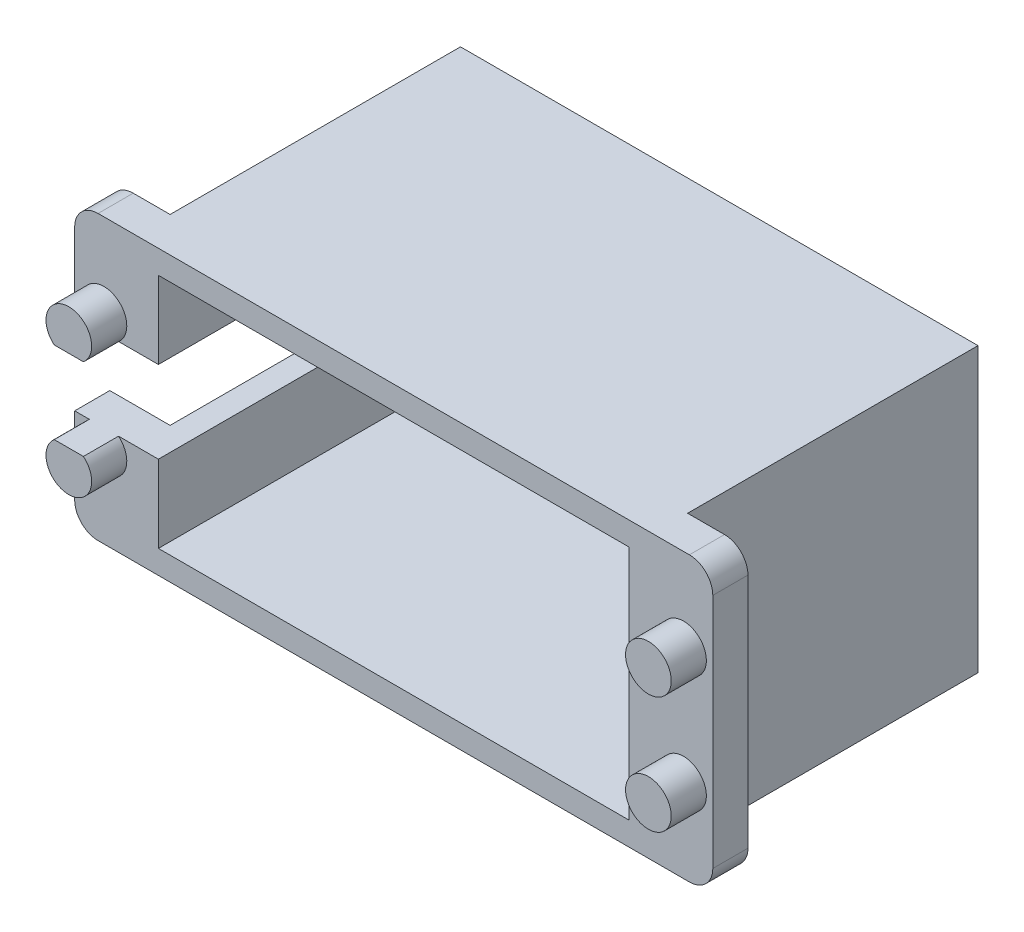
ISO-10303-21;
HEADER;
FILE_DESCRIPTION(('STEP AP214'),'2;1');
FILE_NAME('part.step','',(''),(''),'','','');
FILE_SCHEMA(('AUTOMOTIVE_DESIGN { 1 0 10303 214 1 1 1 1 }'));
ENDSEC;
DATA;
#1=APPLICATION_CONTEXT('core data for automotive mechanical design processes');
#2=APPLICATION_PROTOCOL_DEFINITION('international standard','automotive_design',2000,#1);
#3=PRODUCT_CONTEXT('',#1,'mechanical');
#4=PRODUCT('Part','Part','',(#3));
#5=PRODUCT_RELATED_PRODUCT_CATEGORY('part','',(#4));
#6=PRODUCT_DEFINITION_FORMATION('','',#4);
#7=PRODUCT_DEFINITION_CONTEXT('part definition',#1,'design');
#8=PRODUCT_DEFINITION('design','',#6,#7);
#9=PRODUCT_DEFINITION_SHAPE('','',#8);
#10=(LENGTH_UNIT() NAMED_UNIT(*) SI_UNIT(.MILLI.,.METRE.));
#11=(NAMED_UNIT(*) PLANE_ANGLE_UNIT() SI_UNIT($,.RADIAN.));
#12=(NAMED_UNIT(*) SI_UNIT($,.STERADIAN.) SOLID_ANGLE_UNIT());
#13=UNCERTAINTY_MEASURE_WITH_UNIT(LENGTH_MEASURE(1.E-05),#10,'distance_accuracy_value','');
#14=(GEOMETRIC_REPRESENTATION_CONTEXT(3) GLOBAL_UNCERTAINTY_ASSIGNED_CONTEXT((#13)) GLOBAL_UNIT_ASSIGNED_CONTEXT((#10,
#11,#12)) REPRESENTATION_CONTEXT('',''));
#15=CARTESIAN_POINT('',(0.,0.,0.));
#16=DIRECTION('',(0.,0.,1.));
#17=DIRECTION('',(1.,0.,0.));
#18=AXIS2_PLACEMENT_3D('',#15,#16,#17);
#19=CARTESIAN_POINT('',(0.,0.,27.8));
#20=DIRECTION('',(0.,0.,1.));
#21=DIRECTION('',(1.,0.,0.));
#22=AXIS2_PLACEMENT_3D('',#19,#20,#21);
#23=PLANE('',#22);
#24=CARTESIAN_POINT('',(44.85,15.1,27.8));
#25=DIRECTION('',(0.,0.,1.));
#26=DIRECTION('',(-1.,0.,0.));
#27=AXIS2_PLACEMENT_3D('',#24,#25,#26);
#28=CIRCLE('',#27,1.95);
#29=CARTESIAN_POINT('',(42.9,15.1,27.8));
#30=VERTEX_POINT('',#29);
#31=EDGE_CURVE('E508',#30,#30,#28,.T.);
#32=ORIENTED_EDGE('',*,*,#31,.F.);
#33=EDGE_LOOP('',(#32));
#34=FACE_BOUND('',#33,.T.);
#35=CARTESIAN_POINT('',(44.85,5.1,27.8));
#36=DIRECTION('',(0.,0.,1.));
#37=DIRECTION('',(-1.,0.,0.));
#38=AXIS2_PLACEMENT_3D('',#35,#36,#37);
#39=CIRCLE('',#38,1.95);
#40=CARTESIAN_POINT('',(42.9,5.1,27.8));
#41=VERTEX_POINT('',#40);
#42=EDGE_CURVE('E371',#41,#41,#39,.T.);
#43=ORIENTED_EDGE('',*,*,#42,.F.);
#44=EDGE_LOOP('',(#43));
#45=FACE_BOUND('',#44,.T.);
#46=DIRECTION('',(1.,0.,0.));
#47=VECTOR('',#46,1.);
#48=CARTESIAN_POINT('',(0.,6.6,27.8));
#49=LINE('',#48,#47);
#50=CARTESIAN_POINT('',(-3.40400642056229,6.6,27.8));
#51=VERTEX_POINT('',#50);
#52=CARTESIAN_POINT('',(0.,6.6,27.8));
#53=VERTEX_POINT('',#52);
#54=EDGE_CURVE('E245',#51,#53,#49,.T.);
#55=ORIENTED_EDGE('',*,*,#54,.F.);
#56=CARTESIAN_POINT('',(-4.65,5.1,27.8));
#57=DIRECTION('',(0.,0.,1.));
#58=DIRECTION('',(1.,0.,0.));
#59=AXIS2_PLACEMENT_3D('',#56,#57,#58);
#60=CIRCLE('',#59,1.95);
#61=CARTESIAN_POINT('',(-5.89599357943771,6.6,27.8));
#62=VERTEX_POINT('',#61);
#63=EDGE_CURVE('E65',#62,#51,#60,.T.);
#64=ORIENTED_EDGE('',*,*,#63,.F.);
#65=CARTESIAN_POINT('',(-7.15,6.6,27.8));
#66=VERTEX_POINT('',#65);
#67=EDGE_CURVE('E242',#66,#62,#49,.T.);
#68=ORIENTED_EDGE('',*,*,#67,.F.);
#69=DIRECTION('',(0.,-1.,0.));
#70=VECTOR('',#69,1.);
#71=CARTESIAN_POINT('',(-7.15,0.,27.8));
#72=LINE('',#71,#70);
#73=CARTESIAN_POINT('',(-7.15,0.,27.8));
#74=VERTEX_POINT('',#73);
#75=EDGE_CURVE('E400',#66,#74,#72,.T.);
#76=ORIENTED_EDGE('',*,*,#75,.T.);
#77=CARTESIAN_POINT('',(-5.15,0.,27.8));
#78=DIRECTION('',(0.,0.,1.));
#79=DIRECTION('',(1.,0.,0.));
#80=AXIS2_PLACEMENT_3D('',#77,#78,#79);
#81=CIRCLE('',#80,2.);
#82=CARTESIAN_POINT('',(-5.14999999999998,-2.,27.8));
#83=VERTEX_POINT('',#82);
#84=EDGE_CURVE('E390',#83,#74,#81,.F.);
#85=ORIENTED_EDGE('',*,*,#84,.F.);
#86=DIRECTION('',(1.,0.,0.));
#87=VECTOR('',#86,1.);
#88=CARTESIAN_POINT('',(0.,-2.,27.8));
#89=LINE('',#88,#87);
#90=CARTESIAN_POINT('',(45.35,-2.,27.8));
#91=VERTEX_POINT('',#90);
#92=EDGE_CURVE('E253',#83,#91,#89,.T.);
#93=ORIENTED_EDGE('',*,*,#92,.T.);
#94=CARTESIAN_POINT('',(45.35,0.,27.8));
#95=DIRECTION('',(0.,0.,1.));
#96=DIRECTION('',(1.,0.,0.));
#97=AXIS2_PLACEMENT_3D('',#94,#95,#96);
#98=CIRCLE('',#97,2.);
#99=CARTESIAN_POINT('',(47.35,0.,27.8));
#100=VERTEX_POINT('',#99);
#101=EDGE_CURVE('E381',#91,#100,#98,.T.);
#102=ORIENTED_EDGE('',*,*,#101,.T.);
#103=DIRECTION('',(0.,-1.,0.));
#104=VECTOR('',#103,1.);
#105=CARTESIAN_POINT('',(47.35,0.,27.8));
#106=LINE('',#105,#104);
#107=CARTESIAN_POINT('',(47.35,20.2,27.8));
#108=VERTEX_POINT('',#107);
#109=EDGE_CURVE('E368',#108,#100,#106,.T.);
#110=ORIENTED_EDGE('',*,*,#109,.F.);
#111=CARTESIAN_POINT('',(45.35,20.2,27.8));
#112=DIRECTION('',(0.,0.,1.));
#113=DIRECTION('',(1.,0.,0.));
#114=AXIS2_PLACEMENT_3D('',#111,#112,#113);
#115=CIRCLE('',#114,2.);
#116=CARTESIAN_POINT('',(45.35,22.2,27.8));
#117=VERTEX_POINT('',#116);
#118=EDGE_CURVE('E364',#117,#108,#115,.F.);
#119=ORIENTED_EDGE('',*,*,#118,.F.);
#120=DIRECTION('',(1.,0.,0.));
#121=VECTOR('',#120,1.);
#122=CARTESIAN_POINT('',(0.,22.2,27.8));
#123=LINE('',#122,#121);
#124=CARTESIAN_POINT('',(-5.14999999999999,22.2,27.8));
#125=VERTEX_POINT('',#124);
#126=EDGE_CURVE('E256',#125,#117,#123,.T.);
#127=ORIENTED_EDGE('',*,*,#126,.F.);
#128=CARTESIAN_POINT('',(-5.15,20.2,27.8));
#129=DIRECTION('',(0.,0.,1.));
#130=DIRECTION('',(1.,0.,0.));
#131=AXIS2_PLACEMENT_3D('',#128,#129,#130);
#132=CIRCLE('',#131,2.);
#133=CARTESIAN_POINT('',(-7.15,20.2,27.8));
#134=VERTEX_POINT('',#133);
#135=EDGE_CURVE('E417',#125,#134,#132,.T.);
#136=ORIENTED_EDGE('',*,*,#135,.T.);
#137=DIRECTION('',(0.,-1.,0.));
#138=VECTOR('',#137,1.);
#139=CARTESIAN_POINT('',(-7.15,0.,27.8));
#140=LINE('',#139,#138);
#141=CARTESIAN_POINT('',(-7.15,13.6,27.8));
#142=VERTEX_POINT('',#141);
#143=EDGE_CURVE('E427',#134,#142,#140,.T.);
#144=ORIENTED_EDGE('',*,*,#143,.T.);
#145=DIRECTION('',(1.,0.,0.));
#146=VECTOR('',#145,1.);
#147=CARTESIAN_POINT('',(0.,13.6,27.8));
#148=LINE('',#147,#146);
#149=CARTESIAN_POINT('',(-5.89599357943771,13.6,27.8));
#150=VERTEX_POINT('',#149);
#151=EDGE_CURVE('E73',#142,#150,#148,.T.);
#152=ORIENTED_EDGE('',*,*,#151,.T.);
#153=CARTESIAN_POINT('',(-4.65,15.1,27.8));
#154=DIRECTION('',(0.,0.,1.));
#155=DIRECTION('',(1.,0.,0.));
#156=AXIS2_PLACEMENT_3D('',#153,#154,#155);
#157=CIRCLE('',#156,1.95);
#158=CARTESIAN_POINT('',(-3.40400642056229,13.6,27.8));
#159=VERTEX_POINT('',#158);
#160=EDGE_CURVE('E489',#159,#150,#157,.T.);
#161=ORIENTED_EDGE('',*,*,#160,.F.);
#162=CARTESIAN_POINT('',(0.,13.6,27.8));
#163=VERTEX_POINT('',#162);
#164=EDGE_CURVE('E266',#159,#163,#148,.T.);
#165=ORIENTED_EDGE('',*,*,#164,.T.);
#166=DIRECTION('',(0.,1.,0.));
#167=VECTOR('',#166,1.);
#168=CARTESIAN_POINT('',(0.,0.,27.8));
#169=LINE('',#168,#167);
#170=CARTESIAN_POINT('',(0.,20.2,27.8));
#171=VERTEX_POINT('',#170);
#172=EDGE_CURVE('E268',#163,#171,#169,.T.);
#173=ORIENTED_EDGE('',*,*,#172,.T.);
#174=DIRECTION('',(1.,0.,0.));
#175=VECTOR('',#174,1.);
#176=CARTESIAN_POINT('',(0.,20.2,27.8));
#177=LINE('',#176,#175);
#178=CARTESIAN_POINT('',(40.2,20.2,27.8));
#179=VERTEX_POINT('',#178);
#180=EDGE_CURVE('E271',#171,#179,#177,.T.);
#181=ORIENTED_EDGE('',*,*,#180,.T.);
#182=DIRECTION('',(0.,1.,0.));
#183=VECTOR('',#182,1.);
#184=CARTESIAN_POINT('',(40.2,0.,27.8));
#185=LINE('',#184,#183);
#186=CARTESIAN_POINT('',(40.2,0.,27.8));
#187=VERTEX_POINT('',#186);
#188=EDGE_CURVE('E275',#187,#179,#185,.T.);
#189=ORIENTED_EDGE('',*,*,#188,.F.);
#190=DIRECTION('',(1.,0.,0.));
#191=VECTOR('',#190,1.);
#192=CARTESIAN_POINT('',(0.,0.,27.8));
#193=LINE('',#192,#191);
#194=CARTESIAN_POINT('',(0.,0.,27.8));
#195=VERTEX_POINT('',#194);
#196=EDGE_CURVE('E278',#195,#187,#193,.T.);
#197=ORIENTED_EDGE('',*,*,#196,.F.);
#198=EDGE_CURVE('E272',#195,#53,#169,.T.);
#199=ORIENTED_EDGE('',*,*,#198,.T.);
#200=EDGE_LOOP('',(#55,#64,#68,#76,#85,#93,#102,#110,#119,#127,#136,#144,#152,#161,#165,#173,
#181,#189,#197,#199));
#201=FACE_BOUND('',#200,.T.);
#202=ADVANCED_FACE('F49',(#34,#45,#201),#23,.T.);
#203=CARTESIAN_POINT('',(-2.,0.,27.8));
#204=DIRECTION('',(1.,0.,0.));
#205=DIRECTION('',(0.,1.,0.));
#206=AXIS2_PLACEMENT_3D('',#203,#204,#205);
#207=PLANE('',#206);
#208=DIRECTION('',(0.,-1.,0.));
#209=VECTOR('',#208,1.);
#210=CARTESIAN_POINT('',(-2.,0.,24.8));
#211=LINE('',#210,#209);
#212=CARTESIAN_POINT('',(-2.,6.6,24.8));
#213=VERTEX_POINT('',#212);
#214=CARTESIAN_POINT('',(-2.,-2.,24.8));
#215=VERTEX_POINT('',#214);
#216=EDGE_CURVE('E403',#213,#215,#211,.T.);
#217=ORIENTED_EDGE('',*,*,#216,.F.);
#218=DIRECTION('',(0.,0.,-1.));
#219=VECTOR('',#218,1.);
#220=CARTESIAN_POINT('',(-2.,6.6,27.8));
#221=LINE('',#220,#219);
#222=CARTESIAN_POINT('',(-2.,6.6,6.44));
#223=VERTEX_POINT('',#222);
#224=EDGE_CURVE('E11',#213,#223,#221,.T.);
#225=ORIENTED_EDGE('',*,*,#224,.T.);
#226=DIRECTION('',(0.,1.,0.));
#227=VECTOR('',#226,1.);
#228=CARTESIAN_POINT('',(-2.,13.6,6.44));
#229=LINE('',#228,#227);
#230=CARTESIAN_POINT('',(-2.,13.6,6.44));
#231=VERTEX_POINT('',#230);
#232=EDGE_CURVE('E456',#223,#231,#229,.T.);
#233=ORIENTED_EDGE('',*,*,#232,.T.);
#234=DIRECTION('',(0.,0.,-1.));
#235=VECTOR('',#234,1.);
#236=CARTESIAN_POINT('',(-2.,13.6,27.8));
#237=LINE('',#236,#235);
#238=CARTESIAN_POINT('',(-2.,13.6,24.8));
#239=VERTEX_POINT('',#238);
#240=EDGE_CURVE('E322',#239,#231,#237,.T.);
#241=ORIENTED_EDGE('',*,*,#240,.F.);
#242=DIRECTION('',(0.,-1.,0.));
#243=VECTOR('',#242,1.);
#244=CARTESIAN_POINT('',(-2.,0.,24.8));
#245=LINE('',#244,#243);
#246=CARTESIAN_POINT('',(-2.,22.2,24.8));
#247=VERTEX_POINT('',#246);
#248=EDGE_CURVE('E436',#247,#239,#245,.T.);
#249=ORIENTED_EDGE('',*,*,#248,.F.);
#250=DIRECTION('',(0.,0.,-1.));
#251=VECTOR('',#250,1.);
#252=CARTESIAN_POINT('',(-2.,22.2,27.8));
#253=LINE('',#252,#251);
#254=CARTESIAN_POINT('',(-2.,22.2,0.));
#255=VERTEX_POINT('',#254);
#256=EDGE_CURVE('E325',#247,#255,#253,.T.);
#257=ORIENTED_EDGE('',*,*,#256,.T.);
#258=DIRECTION('',(0.,-1.,0.));
#259=VECTOR('',#258,1.);
#260=CARTESIAN_POINT('',(-2.,0.,0.));
#261=LINE('',#260,#259);
#262=CARTESIAN_POINT('',(-2.,-2.,0.));
#263=VERTEX_POINT('',#262);
#264=EDGE_CURVE('E282',#255,#263,#261,.T.);
#265=ORIENTED_EDGE('',*,*,#264,.T.);
#266=DIRECTION('',(0.,0.,-1.));
#267=VECTOR('',#266,1.);
#268=CARTESIAN_POINT('',(-2.,-2.,27.8));
#269=LINE('',#268,#267);
#270=EDGE_CURVE('E58',#215,#263,#269,.T.);
#271=ORIENTED_EDGE('',*,*,#270,.F.);
#272=EDGE_LOOP('',(#217,#225,#233,#241,#249,#257,#265,#271));
#273=FACE_BOUND('',#272,.T.);
#274=ADVANCED_FACE('F344',(#273),#207,.F.);
#275=CARTESIAN_POINT('',(0.,6.6,27.8));
#276=DIRECTION('',(0.,1.,0.));
#277=DIRECTION('',(0.,0.,1.));
#278=AXIS2_PLACEMENT_3D('',#275,#276,#277);
#279=PLANE('',#278);
#280=DIRECTION('',(0.,0.,-1.));
#281=VECTOR('',#280,1.);
#282=CARTESIAN_POINT('',(0.,6.6,27.8));
#283=LINE('',#282,#281);
#284=CARTESIAN_POINT('',(0.,6.6,6.44));
#285=VERTEX_POINT('',#284);
#286=EDGE_CURVE('E304',#53,#285,#283,.T.);
#287=ORIENTED_EDGE('',*,*,#286,.T.);
#288=DIRECTION('',(-1.,0.,0.));
#289=VECTOR('',#288,1.);
#290=CARTESIAN_POINT('',(0.,6.6,6.44));
#291=LINE('',#290,#289);
#292=EDGE_CURVE('E454',#285,#223,#291,.T.);
#293=ORIENTED_EDGE('',*,*,#292,.T.);
#294=ORIENTED_EDGE('',*,*,#224,.F.);
#295=DIRECTION('',(-1.,0.,0.));
#296=VECTOR('',#295,1.);
#297=CARTESIAN_POINT('',(0.,6.6,24.8));
#298=LINE('',#297,#296);
#299=CARTESIAN_POINT('',(-7.15,6.6,24.8));
#300=VERTEX_POINT('',#299);
#301=EDGE_CURVE('E405',#213,#300,#298,.T.);
#302=ORIENTED_EDGE('',*,*,#301,.T.);
#303=DIRECTION('',(0.,0.,1.));
#304=VECTOR('',#303,1.);
#305=CARTESIAN_POINT('',(-7.15,6.6,24.8));
#306=LINE('',#305,#304);
#307=EDGE_CURVE('E251',#300,#66,#306,.T.);
#308=ORIENTED_EDGE('',*,*,#307,.T.);
#309=ORIENTED_EDGE('',*,*,#67,.T.);
#310=DIRECTION('',(0.,0.,-1.));
#311=VECTOR('',#310,1.);
#312=CARTESIAN_POINT('',(-5.89599357943771,6.6,30.8));
#313=LINE('',#312,#311);
#314=CARTESIAN_POINT('',(-5.89599357943771,6.6,30.8));
#315=VERTEX_POINT('',#314);
#316=EDGE_CURVE('E231',#315,#62,#313,.T.);
#317=ORIENTED_EDGE('',*,*,#316,.F.);
#318=DIRECTION('',(-1.,0.,0.));
#319=VECTOR('',#318,1.);
#320=CARTESIAN_POINT('',(-5.89599357943771,6.6,30.8));
#321=LINE('',#320,#319);
#322=CARTESIAN_POINT('',(-3.40400642056229,6.6,30.8));
#323=VERTEX_POINT('',#322);
#324=EDGE_CURVE('E237',#323,#315,#321,.T.);
#325=ORIENTED_EDGE('',*,*,#324,.F.);
#326=DIRECTION('',(0.,0.,-1.));
#327=VECTOR('',#326,1.);
#328=CARTESIAN_POINT('',(-3.40400642056229,6.6,30.8));
#329=LINE('',#328,#327);
#330=EDGE_CURVE('E238',#323,#51,#329,.T.);
#331=ORIENTED_EDGE('',*,*,#330,.T.);
#332=ORIENTED_EDGE('',*,*,#54,.T.);
#333=EDGE_LOOP('',(#287,#293,#294,#302,#308,#309,#317,#325,#331,#332));
#334=FACE_BOUND('',#333,.T.);
#335=ADVANCED_FACE('F51',(#334),#279,.T.);
#336=CARTESIAN_POINT('',(0.,13.6,27.8));
#337=DIRECTION('',(0.,1.,0.));
#338=DIRECTION('',(0.,0.,1.));
#339=AXIS2_PLACEMENT_3D('',#336,#337,#338);
#340=PLANE('',#339);
#341=DIRECTION('',(1.,0.,0.));
#342=VECTOR('',#341,1.);
#343=CARTESIAN_POINT('',(0.,13.6,6.44));
#344=LINE('',#343,#342);
#345=CARTESIAN_POINT('',(0.,13.6,6.44));
#346=VERTEX_POINT('',#345);
#347=EDGE_CURVE('E261',#231,#346,#344,.T.);
#348=ORIENTED_EDGE('',*,*,#347,.T.);
#349=DIRECTION('',(0.,0.,-1.));
#350=VECTOR('',#349,1.);
#351=CARTESIAN_POINT('',(0.,13.6,27.8));
#352=LINE('',#351,#350);
#353=EDGE_CURVE('E318',#163,#346,#352,.T.);
#354=ORIENTED_EDGE('',*,*,#353,.F.);
#355=ORIENTED_EDGE('',*,*,#164,.F.);
#356=DIRECTION('',(0.,0.,-1.));
#357=VECTOR('',#356,1.);
#358=CARTESIAN_POINT('',(-3.40400642056229,13.6,30.8));
#359=LINE('',#358,#357);
#360=CARTESIAN_POINT('',(-3.40400642056229,13.6,30.8));
#361=VERTEX_POINT('',#360);
#362=EDGE_CURVE('E493',#361,#159,#359,.T.);
#363=ORIENTED_EDGE('',*,*,#362,.F.);
#364=DIRECTION('',(1.,0.,0.));
#365=VECTOR('',#364,1.);
#366=CARTESIAN_POINT('',(-5.89599357943771,13.6,30.8));
#367=LINE('',#366,#365);
#368=CARTESIAN_POINT('',(-5.89599357943771,13.6,30.8));
#369=VERTEX_POINT('',#368);
#370=EDGE_CURVE('E495',#369,#361,#367,.T.);
#371=ORIENTED_EDGE('',*,*,#370,.F.);
#372=DIRECTION('',(0.,0.,-1.));
#373=VECTOR('',#372,1.);
#374=CARTESIAN_POINT('',(-5.89599357943771,13.6,30.8));
#375=LINE('',#374,#373);
#376=EDGE_CURVE('E247',#369,#150,#375,.T.);
#377=ORIENTED_EDGE('',*,*,#376,.T.);
#378=ORIENTED_EDGE('',*,*,#151,.F.);
#379=DIRECTION('',(0.,0.,1.));
#380=VECTOR('',#379,1.);
#381=CARTESIAN_POINT('',(-7.15,13.6,24.8));
#382=LINE('',#381,#380);
#383=CARTESIAN_POINT('',(-7.15,13.6,24.8));
#384=VERTEX_POINT('',#383);
#385=EDGE_CURVE('E444',#384,#142,#382,.T.);
#386=ORIENTED_EDGE('',*,*,#385,.F.);
#387=DIRECTION('',(-1.,0.,0.));
#388=VECTOR('',#387,1.);
#389=CARTESIAN_POINT('',(0.,13.6,24.8));
#390=LINE('',#389,#388);
#391=EDGE_CURVE('E433',#239,#384,#390,.T.);
#392=ORIENTED_EDGE('',*,*,#391,.F.);
#393=ORIENTED_EDGE('',*,*,#240,.T.);
#394=EDGE_LOOP('',(#348,#354,#355,#363,#371,#377,#378,#386,#392,#393));
#395=FACE_BOUND('',#394,.T.);
#396=ADVANCED_FACE('F462',(#395),#340,.F.);
#397=CARTESIAN_POINT('',(0.,-2.,27.8));
#398=DIRECTION('',(0.,1.,0.));
#399=DIRECTION('',(0.,0.,1.));
#400=AXIS2_PLACEMENT_3D('',#397,#398,#399);
#401=PLANE('',#400);
#402=DIRECTION('',(1.,0.,0.));
#403=VECTOR('',#402,1.);
#404=CARTESIAN_POINT('',(0.,-2.,0.));
#405=LINE('',#404,#403);
#406=CARTESIAN_POINT('',(42.2,-2.,0.));
#407=VERTEX_POINT('',#406);
#408=EDGE_CURVE('E287',#263,#407,#405,.T.);
#409=ORIENTED_EDGE('',*,*,#408,.T.);
#410=DIRECTION('',(0.,0.,-1.));
#411=VECTOR('',#410,1.);
#412=CARTESIAN_POINT('',(42.2,-2.,27.8));
#413=LINE('',#412,#411);
#414=CARTESIAN_POINT('',(42.2,-2.,24.8));
#415=VERTEX_POINT('',#414);
#416=EDGE_CURVE('E330',#415,#407,#413,.T.);
#417=ORIENTED_EDGE('',*,*,#416,.F.);
#418=DIRECTION('',(1.,0.,0.));
#419=VECTOR('',#418,1.);
#420=CARTESIAN_POINT('',(0.,-2.,24.8));
#421=LINE('',#420,#419);
#422=CARTESIAN_POINT('',(45.35,-2.,24.8));
#423=VERTEX_POINT('',#422);
#424=EDGE_CURVE('E357',#415,#423,#421,.T.);
#425=ORIENTED_EDGE('',*,*,#424,.T.);
#426=DIRECTION('',(0.,0.,1.));
#427=VECTOR('',#426,1.);
#428=CARTESIAN_POINT('',(45.35,-2.,24.8));
#429=LINE('',#428,#427);
#430=EDGE_CURVE('E380',#423,#91,#429,.T.);
#431=ORIENTED_EDGE('',*,*,#430,.T.);
#432=ORIENTED_EDGE('',*,*,#92,.F.);
#433=DIRECTION('',(0.,0.,1.));
#434=VECTOR('',#433,1.);
#435=CARTESIAN_POINT('',(-5.14999999999998,-2.,24.8));
#436=LINE('',#435,#434);
#437=CARTESIAN_POINT('',(-5.14999999999998,-2.,24.8));
#438=VERTEX_POINT('',#437);
#439=EDGE_CURVE('E411',#438,#83,#436,.T.);
#440=ORIENTED_EDGE('',*,*,#439,.F.);
#441=DIRECTION('',(-1.,0.,0.));
#442=VECTOR('',#441,1.);
#443=CARTESIAN_POINT('',(0.,-2.,24.8));
#444=LINE('',#443,#442);
#445=EDGE_CURVE('E340',#215,#438,#444,.T.);
#446=ORIENTED_EDGE('',*,*,#445,.F.);
#447=ORIENTED_EDGE('',*,*,#270,.T.);
#448=EDGE_LOOP('',(#409,#417,#425,#431,#432,#440,#446,#447));
#449=FACE_BOUND('',#448,.T.);
#450=ADVANCED_FACE('F336',(#449),#401,.F.);
#451=CARTESIAN_POINT('',(42.2,0.,27.8));
#452=DIRECTION('',(1.,0.,0.));
#453=DIRECTION('',(0.,0.,-1.));
#454=AXIS2_PLACEMENT_3D('',#451,#452,#453);
#455=PLANE('',#454);
#456=DIRECTION('',(0.,1.,0.));
#457=VECTOR('',#456,1.);
#458=CARTESIAN_POINT('',(42.2,0.,24.8));
#459=LINE('',#458,#457);
#460=CARTESIAN_POINT('',(42.2,22.2,24.8));
#461=VERTEX_POINT('',#460);
#462=EDGE_CURVE('E353',#415,#461,#459,.T.);
#463=ORIENTED_EDGE('',*,*,#462,.F.);
#464=ORIENTED_EDGE('',*,*,#416,.T.);
#465=DIRECTION('',(0.,-1.,0.));
#466=VECTOR('',#465,1.);
#467=CARTESIAN_POINT('',(42.2,0.,0.));
#468=LINE('',#467,#466);
#469=CARTESIAN_POINT('',(42.2,22.2,0.));
#470=VERTEX_POINT('',#469);
#471=EDGE_CURVE('E290',#470,#407,#468,.T.);
#472=ORIENTED_EDGE('',*,*,#471,.F.);
#473=DIRECTION('',(0.,0.,-1.));
#474=VECTOR('',#473,1.);
#475=CARTESIAN_POINT('',(42.2,22.2,27.8));
#476=LINE('',#475,#474);
#477=EDGE_CURVE('E328',#461,#470,#476,.T.);
#478=ORIENTED_EDGE('',*,*,#477,.F.);
#479=EDGE_LOOP('',(#463,#464,#472,#478));
#480=FACE_BOUND('',#479,.T.);
#481=ADVANCED_FACE('F351',(#480),#455,.T.);
#482=CARTESIAN_POINT('',(0.,22.2,27.8));
#483=DIRECTION('',(0.,1.,0.));
#484=DIRECTION('',(0.,0.,1.));
#485=AXIS2_PLACEMENT_3D('',#482,#483,#484);
#486=PLANE('',#485);
#487=DIRECTION('',(1.,0.,0.));
#488=VECTOR('',#487,1.);
#489=CARTESIAN_POINT('',(0.,22.2,0.));
#490=LINE('',#489,#488);
#491=EDGE_CURVE('E286',#255,#470,#490,.T.);
#492=ORIENTED_EDGE('',*,*,#491,.F.);
#493=ORIENTED_EDGE('',*,*,#256,.F.);
#494=DIRECTION('',(-1.,0.,0.));
#495=VECTOR('',#494,1.);
#496=CARTESIAN_POINT('',(0.,22.2,24.8));
#497=LINE('',#496,#495);
#498=CARTESIAN_POINT('',(-5.14999999999999,22.2,24.8));
#499=VERTEX_POINT('',#498);
#500=EDGE_CURVE('E422',#247,#499,#497,.T.);
#501=ORIENTED_EDGE('',*,*,#500,.T.);
#502=DIRECTION('',(0.,0.,1.));
#503=VECTOR('',#502,1.);
#504=CARTESIAN_POINT('',(-5.14999999999999,22.2,24.8));
#505=LINE('',#504,#503);
#506=EDGE_CURVE('E440',#499,#125,#505,.T.);
#507=ORIENTED_EDGE('',*,*,#506,.T.);
#508=ORIENTED_EDGE('',*,*,#126,.T.);
#509=DIRECTION('',(0.,0.,1.));
#510=VECTOR('',#509,1.);
#511=CARTESIAN_POINT('',(45.35,22.2,24.8));
#512=LINE('',#511,#510);
#513=CARTESIAN_POINT('',(45.35,22.2,24.8));
#514=VERTEX_POINT('',#513);
#515=EDGE_CURVE('E387',#514,#117,#512,.T.);
#516=ORIENTED_EDGE('',*,*,#515,.F.);
#517=DIRECTION('',(1.,0.,0.));
#518=VECTOR('',#517,1.);
#519=CARTESIAN_POINT('',(0.,22.2,24.8));
#520=LINE('',#519,#518);
#521=EDGE_CURVE('E377',#461,#514,#520,.T.);
#522=ORIENTED_EDGE('',*,*,#521,.F.);
#523=ORIENTED_EDGE('',*,*,#477,.T.);
#524=EDGE_LOOP('',(#492,#493,#501,#507,#508,#516,#522,#523));
#525=FACE_BOUND('',#524,.T.);
#526=ADVANCED_FACE('F545',(#525),#486,.T.);
#527=CARTESIAN_POINT('',(0.,20.2,27.8));
#528=DIRECTION('',(0.,1.,0.));
#529=DIRECTION('',(0.,0.,1.));
#530=AXIS2_PLACEMENT_3D('',#527,#528,#529);
#531=PLANE('',#530);
#532=DIRECTION('',(1.,0.,0.));
#533=VECTOR('',#532,1.);
#534=CARTESIAN_POINT('',(0.,20.2,0.));
#535=LINE('',#534,#533);
#536=CARTESIAN_POINT('',(0.,20.2,0.));
#537=VERTEX_POINT('',#536);
#538=CARTESIAN_POINT('',(40.2,20.2,0.));
#539=VERTEX_POINT('',#538);
#540=EDGE_CURVE('E285',#537,#539,#535,.T.);
#541=ORIENTED_EDGE('',*,*,#540,.T.);
#542=DIRECTION('',(0.,0.,-1.));
#543=VECTOR('',#542,1.);
#544=CARTESIAN_POINT('',(40.2,20.2,27.8));
#545=LINE('',#544,#543);
#546=EDGE_CURVE('E312',#179,#539,#545,.T.);
#547=ORIENTED_EDGE('',*,*,#546,.F.);
#548=ORIENTED_EDGE('',*,*,#180,.F.);
#549=DIRECTION('',(0.,0.,-1.));
#550=VECTOR('',#549,1.);
#551=CARTESIAN_POINT('',(0.,20.2,27.8));
#552=LINE('',#551,#550);
#553=EDGE_CURVE('E314',#171,#537,#552,.T.);
#554=ORIENTED_EDGE('',*,*,#553,.T.);
#555=EDGE_LOOP('',(#541,#547,#548,#554));
#556=FACE_BOUND('',#555,.T.);
#557=ADVANCED_FACE('F486',(#556),#531,.F.);
#558=CARTESIAN_POINT('',(40.2,0.,27.8));
#559=DIRECTION('',(-1.,0.,0.));
#560=DIRECTION('',(0.,0.,1.));
#561=AXIS2_PLACEMENT_3D('',#558,#559,#560);
#562=PLANE('',#561);
#563=DIRECTION('',(0.,1.,0.));
#564=VECTOR('',#563,1.);
#565=CARTESIAN_POINT('',(40.2,0.,0.));
#566=LINE('',#565,#564);
#567=CARTESIAN_POINT('',(40.2,0.,0.));
#568=VERTEX_POINT('',#567);
#569=EDGE_CURVE('E299',#568,#539,#566,.T.);
#570=ORIENTED_EDGE('',*,*,#569,.F.);
#571=DIRECTION('',(0.,0.,-1.));
#572=VECTOR('',#571,1.);
#573=CARTESIAN_POINT('',(40.2,0.,27.8));
#574=LINE('',#573,#572);
#575=EDGE_CURVE('E310',#187,#568,#574,.T.);
#576=ORIENTED_EDGE('',*,*,#575,.F.);
#577=ORIENTED_EDGE('',*,*,#188,.T.);
#578=ORIENTED_EDGE('',*,*,#546,.T.);
#579=EDGE_LOOP('',(#570,#576,#577,#578));
#580=FACE_BOUND('',#579,.T.);
#581=ADVANCED_FACE('F539',(#580),#562,.T.);
#582=CARTESIAN_POINT('',(0.,0.,27.8));
#583=DIRECTION('',(0.,1.,0.));
#584=DIRECTION('',(0.,0.,1.));
#585=AXIS2_PLACEMENT_3D('',#582,#583,#584);
#586=PLANE('',#585);
#587=DIRECTION('',(1.,0.,0.));
#588=VECTOR('',#587,1.);
#589=CARTESIAN_POINT('',(0.,0.,0.));
#590=LINE('',#589,#588);
#591=CARTESIAN_POINT('',(0.,0.,0.));
#592=VERTEX_POINT('',#591);
#593=EDGE_CURVE('E296',#592,#568,#590,.T.);
#594=ORIENTED_EDGE('',*,*,#593,.F.);
#595=DIRECTION('',(0.,0.,-1.));
#596=VECTOR('',#595,1.);
#597=CARTESIAN_POINT('',(0.,0.,27.8));
#598=LINE('',#597,#596);
#599=EDGE_CURVE('E307',#195,#592,#598,.T.);
#600=ORIENTED_EDGE('',*,*,#599,.F.);
#601=ORIENTED_EDGE('',*,*,#196,.T.);
#602=ORIENTED_EDGE('',*,*,#575,.T.);
#603=EDGE_LOOP('',(#594,#600,#601,#602));
#604=FACE_BOUND('',#603,.T.);
#605=ADVANCED_FACE('F480',(#604),#586,.T.);
#606=CARTESIAN_POINT('',(0.,0.,27.8));
#607=DIRECTION('',(-1.,0.,0.));
#608=DIRECTION('',(0.,0.,1.));
#609=AXIS2_PLACEMENT_3D('',#606,#607,#608);
#610=PLANE('',#609);
#611=DIRECTION('',(0.,1.,0.));
#612=VECTOR('',#611,1.);
#613=CARTESIAN_POINT('',(0.,0.,0.));
#614=LINE('',#613,#612);
#615=EDGE_CURVE('E259',#592,#537,#614,.T.);
#616=ORIENTED_EDGE('',*,*,#615,.T.);
#617=ORIENTED_EDGE('',*,*,#553,.F.);
#618=ORIENTED_EDGE('',*,*,#172,.F.);
#619=ORIENTED_EDGE('',*,*,#353,.T.);
#620=DIRECTION('',(0.,-1.,0.));
#621=VECTOR('',#620,1.);
#622=CARTESIAN_POINT('',(0.,13.6,6.44));
#623=LINE('',#622,#621);
#624=EDGE_CURVE('E447',#346,#285,#623,.T.);
#625=ORIENTED_EDGE('',*,*,#624,.T.);
#626=ORIENTED_EDGE('',*,*,#286,.F.);
#627=ORIENTED_EDGE('',*,*,#198,.F.);
#628=ORIENTED_EDGE('',*,*,#599,.T.);
#629=EDGE_LOOP('',(#616,#617,#618,#619,#625,#626,#627,#628));
#630=FACE_BOUND('',#629,.T.);
#631=ADVANCED_FACE('F468',(#630),#610,.F.);
#632=CARTESIAN_POINT('',(0.,0.,0.));
#633=DIRECTION('',(0.,0.,1.));
#634=DIRECTION('',(1.,0.,0.));
#635=AXIS2_PLACEMENT_3D('',#632,#633,#634);
#636=PLANE('',#635);
#637=ORIENTED_EDGE('',*,*,#540,.F.);
#638=ORIENTED_EDGE('',*,*,#615,.F.);
#639=ORIENTED_EDGE('',*,*,#593,.T.);
#640=ORIENTED_EDGE('',*,*,#569,.T.);
#641=EDGE_LOOP('',(#637,#638,#639,#640));
#642=FACE_BOUND('',#641,.T.);
#643=ORIENTED_EDGE('',*,*,#408,.F.);
#644=ORIENTED_EDGE('',*,*,#264,.F.);
#645=ORIENTED_EDGE('',*,*,#491,.T.);
#646=ORIENTED_EDGE('',*,*,#471,.T.);
#647=EDGE_LOOP('',(#643,#644,#645,#646));
#648=FACE_BOUND('',#647,.T.);
#649=ADVANCED_FACE('F348',(#642,#648),#636,.F.);
#650=CARTESIAN_POINT('',(0.,0.,6.44));
#651=DIRECTION('',(0.,0.,-1.));
#652=DIRECTION('',(-1.,0.,0.));
#653=AXIS2_PLACEMENT_3D('',#650,#651,#652);
#654=PLANE('',#653);
#655=ORIENTED_EDGE('',*,*,#624,.F.);
#656=ORIENTED_EDGE('',*,*,#347,.F.);
#657=ORIENTED_EDGE('',*,*,#232,.F.);
#658=ORIENTED_EDGE('',*,*,#292,.F.);
#659=EDGE_LOOP('',(#655,#656,#657,#658));
#660=FACE_BOUND('',#659,.T.);
#661=ADVANCED_FACE('F471',(#660),#654,.F.);
#662=CARTESIAN_POINT('',(-7.15,0.,24.8));
#663=DIRECTION('',(-1.,0.,0.));
#664=DIRECTION('',(0.,-1.,0.));
#665=AXIS2_PLACEMENT_3D('',#662,#663,#664);
#666=PLANE('',#665);
#667=ORIENTED_EDGE('',*,*,#143,.F.);
#668=DIRECTION('',(0.,0.,1.));
#669=VECTOR('',#668,1.);
#670=CARTESIAN_POINT('',(-7.15,20.2,24.8));
#671=LINE('',#670,#669);
#672=CARTESIAN_POINT('',(-7.15,20.2,24.8));
#673=VERTEX_POINT('',#672);
#674=EDGE_CURVE('E448',#673,#134,#671,.T.);
#675=ORIENTED_EDGE('',*,*,#674,.F.);
#676=DIRECTION('',(0.,-1.,0.));
#677=VECTOR('',#676,1.);
#678=CARTESIAN_POINT('',(-7.15,0.,24.8));
#679=LINE('',#678,#677);
#680=EDGE_CURVE('E430',#673,#384,#679,.T.);
#681=ORIENTED_EDGE('',*,*,#680,.T.);
#682=ORIENTED_EDGE('',*,*,#385,.T.);
#683=EDGE_LOOP('',(#667,#675,#681,#682));
#684=FACE_BOUND('',#683,.T.);
#685=ADVANCED_FACE('F572',(#684),#666,.T.);
#686=CARTESIAN_POINT('',(-5.15,20.2,24.8));
#687=DIRECTION('',(0.,0.,1.));
#688=DIRECTION('',(1.,0.,0.));
#689=AXIS2_PLACEMENT_3D('',#686,#687,#688);
#690=CYLINDRICAL_SURFACE('',#689,2.);
#691=ORIENTED_EDGE('',*,*,#135,.F.);
#692=ORIENTED_EDGE('',*,*,#506,.F.);
#693=CARTESIAN_POINT('',(-5.15,20.2,24.8));
#694=DIRECTION('',(0.,0.,1.));
#695=DIRECTION('',(1.,0.,0.));
#696=AXIS2_PLACEMENT_3D('',#693,#694,#695);
#697=CIRCLE('',#696,2.);
#698=EDGE_CURVE('E426',#499,#673,#697,.T.);
#699=ORIENTED_EDGE('',*,*,#698,.T.);
#700=ORIENTED_EDGE('',*,*,#674,.T.);
#701=EDGE_LOOP('',(#691,#692,#699,#700));
#702=FACE_BOUND('',#701,.T.);
#703=ADVANCED_FACE('F575',(#702),#690,.T.);
#704=CARTESIAN_POINT('',(0.,0.,24.8));
#705=DIRECTION('',(0.,0.,1.));
#706=DIRECTION('',(1.,0.,0.));
#707=AXIS2_PLACEMENT_3D('',#704,#705,#706);
#708=PLANE('',#707);
#709=ORIENTED_EDGE('',*,*,#500,.F.);
#710=ORIENTED_EDGE('',*,*,#248,.T.);
#711=ORIENTED_EDGE('',*,*,#391,.T.);
#712=ORIENTED_EDGE('',*,*,#680,.F.);
#713=ORIENTED_EDGE('',*,*,#698,.F.);
#714=EDGE_LOOP('',(#709,#710,#711,#712,#713));
#715=FACE_BOUND('',#714,.T.);
#716=ADVANCED_FACE('F584',(#715),#708,.F.);
#717=CARTESIAN_POINT('',(-5.15,0.,24.8));
#718=DIRECTION('',(0.,0.,1.));
#719=DIRECTION('',(1.,0.,0.));
#720=AXIS2_PLACEMENT_3D('',#717,#718,#719);
#721=CYLINDRICAL_SURFACE('',#720,2.);
#722=ORIENTED_EDGE('',*,*,#84,.T.);
#723=DIRECTION('',(0.,0.,1.));
#724=VECTOR('',#723,1.);
#725=CARTESIAN_POINT('',(-7.15,0.,24.8));
#726=LINE('',#725,#724);
#727=CARTESIAN_POINT('',(-7.15,0.,24.8));
#728=VERTEX_POINT('',#727);
#729=EDGE_CURVE('E415',#728,#74,#726,.T.);
#730=ORIENTED_EDGE('',*,*,#729,.F.);
#731=CARTESIAN_POINT('',(-5.15,0.,24.8));
#732=DIRECTION('',(0.,0.,1.));
#733=DIRECTION('',(1.,0.,0.));
#734=AXIS2_PLACEMENT_3D('',#731,#732,#733);
#735=CIRCLE('',#734,2.);
#736=EDGE_CURVE('E397',#438,#728,#735,.F.);
#737=ORIENTED_EDGE('',*,*,#736,.F.);
#738=ORIENTED_EDGE('',*,*,#439,.T.);
#739=EDGE_LOOP('',(#722,#730,#737,#738));
#740=FACE_BOUND('',#739,.T.);
#741=ADVANCED_FACE('F592',(#740),#721,.T.);
#742=CARTESIAN_POINT('',(-7.15,0.,24.8));
#743=DIRECTION('',(-1.,0.,0.));
#744=DIRECTION('',(0.,-1.,0.));
#745=AXIS2_PLACEMENT_3D('',#742,#743,#744);
#746=PLANE('',#745);
#747=ORIENTED_EDGE('',*,*,#75,.F.);
#748=ORIENTED_EDGE('',*,*,#307,.F.);
#749=DIRECTION('',(0.,-1.,0.));
#750=VECTOR('',#749,1.);
#751=CARTESIAN_POINT('',(-7.15,0.,24.8));
#752=LINE('',#751,#750);
#753=EDGE_CURVE('E408',#300,#728,#752,.T.);
#754=ORIENTED_EDGE('',*,*,#753,.T.);
#755=ORIENTED_EDGE('',*,*,#729,.T.);
#756=EDGE_LOOP('',(#747,#748,#754,#755));
#757=FACE_BOUND('',#756,.T.);
#758=ADVANCED_FACE('F601',(#757),#746,.T.);
#759=CARTESIAN_POINT('',(0.,0.,24.8));
#760=DIRECTION('',(0.,0.,1.));
#761=DIRECTION('',(1.,0.,0.));
#762=AXIS2_PLACEMENT_3D('',#759,#760,#761);
#763=PLANE('',#762);
#764=ORIENTED_EDGE('',*,*,#736,.T.);
#765=ORIENTED_EDGE('',*,*,#753,.F.);
#766=ORIENTED_EDGE('',*,*,#301,.F.);
#767=ORIENTED_EDGE('',*,*,#216,.T.);
#768=ORIENTED_EDGE('',*,*,#445,.T.);
#769=EDGE_LOOP('',(#764,#765,#766,#767,#768));
#770=FACE_BOUND('',#769,.T.);
#771=ADVANCED_FACE('F610',(#770),#763,.F.);
#772=CARTESIAN_POINT('',(45.35,20.2,24.8));
#773=DIRECTION('',(0.,0.,1.));
#774=DIRECTION('',(1.,0.,0.));
#775=AXIS2_PLACEMENT_3D('',#772,#773,#774);
#776=CYLINDRICAL_SURFACE('',#775,2.);
#777=ORIENTED_EDGE('',*,*,#118,.T.);
#778=DIRECTION('',(0.,0.,1.));
#779=VECTOR('',#778,1.);
#780=CARTESIAN_POINT('',(47.35,20.2,24.8));
#781=LINE('',#780,#779);
#782=CARTESIAN_POINT('',(47.35,20.2,24.8));
#783=VERTEX_POINT('',#782);
#784=EDGE_CURVE('E391',#783,#108,#781,.T.);
#785=ORIENTED_EDGE('',*,*,#784,.F.);
#786=CARTESIAN_POINT('',(45.35,20.2,24.8));
#787=DIRECTION('',(0.,0.,1.));
#788=DIRECTION('',(1.,0.,0.));
#789=AXIS2_PLACEMENT_3D('',#786,#787,#788);
#790=CIRCLE('',#789,2.);
#791=EDGE_CURVE('E375',#514,#783,#790,.F.);
#792=ORIENTED_EDGE('',*,*,#791,.F.);
#793=ORIENTED_EDGE('',*,*,#515,.T.);
#794=EDGE_LOOP('',(#777,#785,#792,#793));
#795=FACE_BOUND('',#794,.T.);
#796=ADVANCED_FACE('F619',(#795),#776,.T.);
#797=CARTESIAN_POINT('',(47.35,0.,24.8));
#798=DIRECTION('',(-1.,0.,0.));
#799=DIRECTION('',(0.,-1.,0.));
#800=AXIS2_PLACEMENT_3D('',#797,#798,#799);
#801=PLANE('',#800);
#802=ORIENTED_EDGE('',*,*,#109,.T.);
#803=DIRECTION('',(0.,0.,1.));
#804=VECTOR('',#803,1.);
#805=CARTESIAN_POINT('',(47.35,0.,24.8));
#806=LINE('',#805,#804);
#807=CARTESIAN_POINT('',(47.35,0.,24.8));
#808=VERTEX_POINT('',#807);
#809=EDGE_CURVE('E394',#808,#100,#806,.T.);
#810=ORIENTED_EDGE('',*,*,#809,.F.);
#811=DIRECTION('',(0.,-1.,0.));
#812=VECTOR('',#811,1.);
#813=CARTESIAN_POINT('',(47.35,0.,24.8));
#814=LINE('',#813,#812);
#815=EDGE_CURVE('E366',#783,#808,#814,.T.);
#816=ORIENTED_EDGE('',*,*,#815,.F.);
#817=ORIENTED_EDGE('',*,*,#784,.T.);
#818=EDGE_LOOP('',(#802,#810,#816,#817));
#819=FACE_BOUND('',#818,.T.);
#820=ADVANCED_FACE('F628',(#819),#801,.F.);
#821=CARTESIAN_POINT('',(45.35,0.,24.8));
#822=DIRECTION('',(0.,0.,1.));
#823=DIRECTION('',(1.,0.,0.));
#824=AXIS2_PLACEMENT_3D('',#821,#822,#823);
#825=CYLINDRICAL_SURFACE('',#824,2.);
#826=ORIENTED_EDGE('',*,*,#101,.F.);
#827=ORIENTED_EDGE('',*,*,#430,.F.);
#828=CARTESIAN_POINT('',(45.35,0.,24.8));
#829=DIRECTION('',(0.,0.,1.));
#830=DIRECTION('',(1.,0.,0.));
#831=AXIS2_PLACEMENT_3D('',#828,#829,#830);
#832=CIRCLE('',#831,2.);
#833=EDGE_CURVE('E363',#423,#808,#832,.T.);
#834=ORIENTED_EDGE('',*,*,#833,.T.);
#835=ORIENTED_EDGE('',*,*,#809,.T.);
#836=EDGE_LOOP('',(#826,#827,#834,#835));
#837=FACE_BOUND('',#836,.T.);
#838=ADVANCED_FACE('F637',(#837),#825,.T.);
#839=CARTESIAN_POINT('',(0.,0.,24.8));
#840=DIRECTION('',(0.,0.,1.));
#841=DIRECTION('',(1.,0.,0.));
#842=AXIS2_PLACEMENT_3D('',#839,#840,#841);
#843=PLANE('',#842);
#844=ORIENTED_EDGE('',*,*,#424,.F.);
#845=ORIENTED_EDGE('',*,*,#462,.T.);
#846=ORIENTED_EDGE('',*,*,#521,.T.);
#847=ORIENTED_EDGE('',*,*,#791,.T.);
#848=ORIENTED_EDGE('',*,*,#815,.T.);
#849=ORIENTED_EDGE('',*,*,#833,.F.);
#850=EDGE_LOOP('',(#844,#845,#846,#847,#848,#849));
#851=FACE_BOUND('',#850,.T.);
#852=ADVANCED_FACE('F360',(#851),#843,.F.);
#853=CARTESIAN_POINT('',(44.85,5.1,30.8));
#854=DIRECTION('',(0.,0.,-1.));
#855=DIRECTION('',(-1.,0.,0.));
#856=AXIS2_PLACEMENT_3D('',#853,#854,#855);
#857=CYLINDRICAL_SURFACE('',#856,1.95);
#858=CARTESIAN_POINT('',(44.85,5.1,30.8));
#859=DIRECTION('',(0.,0.,1.));
#860=DIRECTION('',(-1.,0.,0.));
#861=AXIS2_PLACEMENT_3D('',#858,#859,#860);
#862=CIRCLE('',#861,1.95);
#863=CARTESIAN_POINT('',(42.9,5.1,30.8));
#864=VERTEX_POINT('',#863);
#865=EDGE_CURVE('E384',#864,#864,#862,.T.);
#866=ORIENTED_EDGE('',*,*,#865,.F.);
#867=EDGE_LOOP('',(#866));
#868=FACE_BOUND('',#867,.T.);
#869=ORIENTED_EDGE('',*,*,#42,.T.);
#870=EDGE_LOOP('',(#869));
#871=FACE_BOUND('',#870,.T.);
#872=ADVANCED_FACE('F518',(#868,#871),#857,.T.);
#873=CARTESIAN_POINT('',(44.85,5.1,30.8));
#874=DIRECTION('',(0.,0.,-1.));
#875=DIRECTION('',(-1.,0.,0.));
#876=AXIS2_PLACEMENT_3D('',#873,#874,#875);
#877=PLANE('',#876);
#878=ORIENTED_EDGE('',*,*,#865,.T.);
#879=EDGE_LOOP('',(#878));
#880=FACE_BOUND('',#879,.T.);
#881=ADVANCED_FACE('F694',(#880),#877,.F.);
#882=CARTESIAN_POINT('',(44.85,15.1,30.8));
#883=DIRECTION('',(0.,0.,-1.));
#884=DIRECTION('',(-1.,0.,0.));
#885=AXIS2_PLACEMENT_3D('',#882,#883,#884);
#886=CYLINDRICAL_SURFACE('',#885,1.95);
#887=CARTESIAN_POINT('',(44.85,15.1,30.8));
#888=DIRECTION('',(0.,0.,1.));
#889=DIRECTION('',(-1.,0.,0.));
#890=AXIS2_PLACEMENT_3D('',#887,#888,#889);
#891=CIRCLE('',#890,1.95);
#892=CARTESIAN_POINT('',(42.9,15.1,30.8));
#893=VERTEX_POINT('',#892);
#894=EDGE_CURVE('E504',#893,#893,#891,.T.);
#895=ORIENTED_EDGE('',*,*,#894,.F.);
#896=EDGE_LOOP('',(#895));
#897=FACE_BOUND('',#896,.T.);
#898=ORIENTED_EDGE('',*,*,#31,.T.);
#899=EDGE_LOOP('',(#898));
#900=FACE_BOUND('',#899,.T.);
#901=ADVANCED_FACE('F704',(#897,#900),#886,.T.);
#902=CARTESIAN_POINT('',(44.85,15.1,30.8));
#903=DIRECTION('',(0.,0.,-1.));
#904=DIRECTION('',(-1.,0.,0.));
#905=AXIS2_PLACEMENT_3D('',#902,#903,#904);
#906=PLANE('',#905);
#907=ORIENTED_EDGE('',*,*,#894,.T.);
#908=EDGE_LOOP('',(#907));
#909=FACE_BOUND('',#908,.T.);
#910=ADVANCED_FACE('F713',(#909),#906,.F.);
#911=CARTESIAN_POINT('',(-4.65,15.1,30.8));
#912=DIRECTION('',(0.,0.,-1.));
#913=DIRECTION('',(-1.,0.,0.));
#914=AXIS2_PLACEMENT_3D('',#911,#912,#913);
#915=CYLINDRICAL_SURFACE('',#914,1.95);
#916=ORIENTED_EDGE('',*,*,#160,.T.);
#917=ORIENTED_EDGE('',*,*,#376,.F.);
#918=CARTESIAN_POINT('',(-4.65,15.1,30.8));
#919=DIRECTION('',(0.,0.,1.));
#920=DIRECTION('',(1.,0.,0.));
#921=AXIS2_PLACEMENT_3D('',#918,#919,#920);
#922=CIRCLE('',#921,1.95);
#923=EDGE_CURVE('E500',#361,#369,#922,.T.);
#924=ORIENTED_EDGE('',*,*,#923,.F.);
#925=ORIENTED_EDGE('',*,*,#362,.T.);
#926=EDGE_LOOP('',(#916,#917,#924,#925));
#927=FACE_BOUND('',#926,.T.);
#928=ADVANCED_FACE('F501',(#927),#915,.T.);
#929=CARTESIAN_POINT('',(-4.65,15.1,30.8));
#930=DIRECTION('',(0.,0.,1.));
#931=DIRECTION('',(1.,0.,0.));
#932=AXIS2_PLACEMENT_3D('',#929,#930,#931);
#933=PLANE('',#932);
#934=ORIENTED_EDGE('',*,*,#923,.T.);
#935=ORIENTED_EDGE('',*,*,#370,.T.);
#936=EDGE_LOOP('',(#934,#935));
#937=FACE_BOUND('',#936,.T.);
#938=ADVANCED_FACE('F732',(#937),#933,.T.);
#939=CARTESIAN_POINT('',(-4.65,5.1,30.8));
#940=DIRECTION('',(0.,0.,-1.));
#941=DIRECTION('',(-1.,0.,0.));
#942=AXIS2_PLACEMENT_3D('',#939,#940,#941);
#943=CYLINDRICAL_SURFACE('',#942,1.95);
#944=ORIENTED_EDGE('',*,*,#63,.T.);
#945=ORIENTED_EDGE('',*,*,#330,.F.);
#946=CARTESIAN_POINT('',(-4.65,5.1,30.8));
#947=DIRECTION('',(0.,0.,1.));
#948=DIRECTION('',(1.,0.,0.));
#949=AXIS2_PLACEMENT_3D('',#946,#947,#948);
#950=CIRCLE('',#949,1.95);
#951=EDGE_CURVE('E234',#315,#323,#950,.T.);
#952=ORIENTED_EDGE('',*,*,#951,.F.);
#953=ORIENTED_EDGE('',*,*,#316,.T.);
#954=EDGE_LOOP('',(#944,#945,#952,#953));
#955=FACE_BOUND('',#954,.T.);
#956=ADVANCED_FACE('F232',(#955),#943,.T.);
#957=CARTESIAN_POINT('',(-4.65,5.1,30.8));
#958=DIRECTION('',(0.,0.,1.));
#959=DIRECTION('',(1.,0.,0.));
#960=AXIS2_PLACEMENT_3D('',#957,#958,#959);
#961=PLANE('',#960);
#962=ORIENTED_EDGE('',*,*,#951,.T.);
#963=ORIENTED_EDGE('',*,*,#324,.T.);
#964=EDGE_LOOP('',(#962,#963));
#965=FACE_BOUND('',#964,.T.);
#966=ADVANCED_FACE('F749',(#965),#961,.T.);
#967=CLOSED_SHELL('',(#202,#274,#335,#396,#450,#481,#526,#557,#581,#605,#631,#649,#661,#685,
#703,#716,#741,#758,#771,#796,#820,#838,#852,#872,#881,#901,#910,#928,#938,#956,#966));
#968=MANIFOLD_SOLID_BREP('B2',#967);
#969=ADVANCED_BREP_SHAPE_REPRESENTATION('',(#18,#968),#14);
#970=SHAPE_DEFINITION_REPRESENTATION(#9,#969);
ENDSEC;
END-ISO-10303-21;
